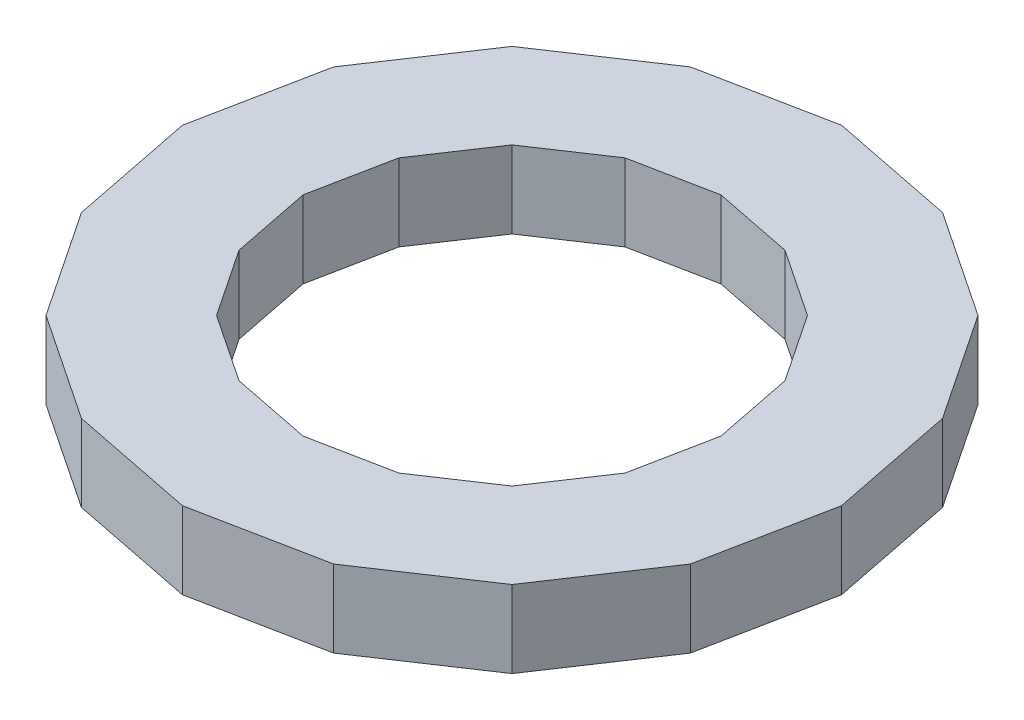
ISO-10303-21;
HEADER;
FILE_DESCRIPTION(('STEP AP214'),'2;1');
FILE_NAME('part.step','',(''),(''),'','','');
FILE_SCHEMA(('AUTOMOTIVE_DESIGN { 1 0 10303 214 1 1 1 1 }'));
ENDSEC;
DATA;
#1=APPLICATION_CONTEXT('core data for automotive mechanical design processes');
#2=APPLICATION_PROTOCOL_DEFINITION('international standard','automotive_design',2000,#1);
#3=PRODUCT_CONTEXT('',#1,'mechanical');
#4=PRODUCT('Part','Part','',(#3));
#5=PRODUCT_RELATED_PRODUCT_CATEGORY('part','',(#4));
#6=PRODUCT_DEFINITION_FORMATION('','',#4);
#7=PRODUCT_DEFINITION_CONTEXT('part definition',#1,'design');
#8=PRODUCT_DEFINITION('design','',#6,#7);
#9=PRODUCT_DEFINITION_SHAPE('','',#8);
#10=(LENGTH_UNIT() NAMED_UNIT(*) SI_UNIT(.MILLI.,.METRE.));
#11=(NAMED_UNIT(*) PLANE_ANGLE_UNIT() SI_UNIT($,.RADIAN.));
#12=(NAMED_UNIT(*) SI_UNIT($,.STERADIAN.) SOLID_ANGLE_UNIT());
#13=UNCERTAINTY_MEASURE_WITH_UNIT(LENGTH_MEASURE(1.E-05),#10,'distance_accuracy_value','');
#14=(GEOMETRIC_REPRESENTATION_CONTEXT(3) GLOBAL_UNCERTAINTY_ASSIGNED_CONTEXT((#13)) GLOBAL_UNIT_ASSIGNED_CONTEXT((#10,
#11,#12)) REPRESENTATION_CONTEXT('',''));
#15=CARTESIAN_POINT('',(0.,0.,0.));
#16=DIRECTION('',(0.,0.,1.));
#17=DIRECTION('',(1.,0.,0.));
#18=AXIS2_PLACEMENT_3D('',#15,#16,#17);
#19=CARTESIAN_POINT('',(0.,19.05,0.));
#20=DIRECTION('',(0.,1.,0.));
#21=DIRECTION('',(0.,0.,1.));
#22=AXIS2_PLACEMENT_3D('',#19,#20,#21);
#23=PLANE('',#22);
#24=DIRECTION('',(-0.195090322016129,0.,0.98078528040323));
#25=VECTOR('',#24,1.);
#26=CARTESIAN_POINT('',(-75.1784477417807,19.05,-31.1399326528025));
#27=LINE('',#26,#25);
#28=CARTESIAN_POINT('',(-75.1784477417807,19.05,-31.1399326528025));
#29=VERTEX_POINT('',#28);
#30=CARTESIAN_POINT('',(-81.3725654657927,19.05,0.));
#31=VERTEX_POINT('',#30);
#32=EDGE_CURVE('E363',#29,#31,#27,.T.);
#33=ORIENTED_EDGE('',*,*,#32,.T.);
#34=DIRECTION('',(0.195090322016128,0.,0.98078528040323));
#35=VECTOR('',#34,1.);
#36=CARTESIAN_POINT('',(-81.3725654657927,19.05,0.));
#37=LINE('',#36,#35);
#38=CARTESIAN_POINT('',(-75.1784477417807,19.05,31.1399326528025));
#39=VERTEX_POINT('',#38);
#40=EDGE_CURVE('E366',#31,#39,#37,.T.);
#41=ORIENTED_EDGE('',*,*,#40,.T.);
#42=DIRECTION('',(0.555570233019602,0.,0.831469612302546));
#43=VECTOR('',#42,1.);
#44=CARTESIAN_POINT('',(-75.1784477417807,19.05,31.1399326528025));
#45=LINE('',#44,#43);
#46=CARTESIAN_POINT('',(-57.5390928434084,19.05,57.5390928434083));
#47=VERTEX_POINT('',#46);
#48=EDGE_CURVE('E369',#39,#47,#45,.T.);
#49=ORIENTED_EDGE('',*,*,#48,.T.);
#50=DIRECTION('',(0.831469612302545,0.,0.555570233019603));
#51=VECTOR('',#50,1.);
#52=CARTESIAN_POINT('',(-57.5390928434084,19.05,57.5390928434083));
#53=LINE('',#52,#51);
#54=CARTESIAN_POINT('',(-31.1399326528025,19.05,75.1784477417807));
#55=VERTEX_POINT('',#54);
#56=EDGE_CURVE('E371',#47,#55,#53,.T.);
#57=ORIENTED_EDGE('',*,*,#56,.T.);
#58=DIRECTION('',(0.98078528040323,0.,0.195090322016128));
#59=VECTOR('',#58,1.);
#60=CARTESIAN_POINT('',(-31.1399326528025,19.05,75.1784477417807));
#61=LINE('',#60,#59);
#62=CARTESIAN_POINT('',(0.,19.05,81.3725654657928));
#63=VERTEX_POINT('',#62);
#64=EDGE_CURVE('E373',#55,#63,#61,.T.);
#65=ORIENTED_EDGE('',*,*,#64,.T.);
#66=DIRECTION('',(0.980785280403231,0.,-0.195090322016128));
#67=VECTOR('',#66,1.);
#68=CARTESIAN_POINT('',(0.,19.05,81.3725654657928));
#69=LINE('',#68,#67);
#70=CARTESIAN_POINT('',(31.1399326528025,19.05,75.1784477417808));
#71=VERTEX_POINT('',#70);
#72=EDGE_CURVE('E375',#63,#71,#69,.T.);
#73=ORIENTED_EDGE('',*,*,#72,.T.);
#74=DIRECTION('',(0.831469612302546,0.,-0.555570233019601));
#75=VECTOR('',#74,1.);
#76=CARTESIAN_POINT('',(31.1399326528025,19.05,75.1784477417808));
#77=LINE('',#76,#75);
#78=CARTESIAN_POINT('',(57.5390928434082,19.05,57.5390928434084));
#79=VERTEX_POINT('',#78);
#80=EDGE_CURVE('E377',#71,#79,#77,.T.);
#81=ORIENTED_EDGE('',*,*,#80,.T.);
#82=DIRECTION('',(0.555570233019603,0.,-0.831469612302545));
#83=VECTOR('',#82,1.);
#84=CARTESIAN_POINT('',(57.5390928434082,19.05,57.5390928434084));
#85=LINE('',#84,#83);
#86=CARTESIAN_POINT('',(75.1784477417806,19.05,31.1399326528027));
#87=VERTEX_POINT('',#86);
#88=EDGE_CURVE('E379',#79,#87,#85,.T.);
#89=ORIENTED_EDGE('',*,*,#88,.T.);
#90=DIRECTION('',(0.195090322016128,0.,-0.980785280403231));
#91=VECTOR('',#90,1.);
#92=CARTESIAN_POINT('',(75.1784477417806,19.05,31.1399326528027));
#93=LINE('',#92,#91);
#94=CARTESIAN_POINT('',(81.3725654657927,19.05,0.));
#95=VERTEX_POINT('',#94);
#96=EDGE_CURVE('E381',#87,#95,#93,.T.);
#97=ORIENTED_EDGE('',*,*,#96,.T.);
#98=DIRECTION('',(-0.195090322016127,0.,-0.980785280403231));
#99=VECTOR('',#98,1.);
#100=CARTESIAN_POINT('',(81.3725654657927,19.05,0.));
#101=LINE('',#100,#99);
#102=CARTESIAN_POINT('',(75.1784477417807,19.05,-31.1399326528024));
#103=VERTEX_POINT('',#102);
#104=EDGE_CURVE('E383',#95,#103,#101,.T.);
#105=ORIENTED_EDGE('',*,*,#104,.T.);
#106=DIRECTION('',(-0.555570233019601,0.,-0.831469612302546));
#107=VECTOR('',#106,1.);
#108=CARTESIAN_POINT('',(75.1784477417807,19.05,-31.1399326528024));
#109=LINE('',#108,#107);
#110=CARTESIAN_POINT('',(57.5390928434083,19.05,-57.5390928434082));
#111=VERTEX_POINT('',#110);
#112=EDGE_CURVE('E385',#103,#111,#109,.T.);
#113=ORIENTED_EDGE('',*,*,#112,.T.);
#114=DIRECTION('',(-0.831469612302545,0.,-0.555570233019603));
#115=VECTOR('',#114,1.);
#116=CARTESIAN_POINT('',(57.5390928434083,19.05,-57.5390928434082));
#117=LINE('',#116,#115);
#118=CARTESIAN_POINT('',(31.1399326528026,19.05,-75.1784477417806));
#119=VERTEX_POINT('',#118);
#120=EDGE_CURVE('E387',#111,#119,#117,.T.);
#121=ORIENTED_EDGE('',*,*,#120,.T.);
#122=DIRECTION('',(-0.98078528040323,0.,-0.195090322016128));
#123=VECTOR('',#122,1.);
#124=CARTESIAN_POINT('',(31.1399326528026,19.05,-75.1784477417806));
#125=LINE('',#124,#123);
#126=CARTESIAN_POINT('',(0.,19.05,-81.3725654657926));
#127=VERTEX_POINT('',#126);
#128=EDGE_CURVE('E389',#119,#127,#125,.T.);
#129=ORIENTED_EDGE('',*,*,#128,.T.);
#130=DIRECTION('',(-0.980785280403231,0.,0.195090322016127));
#131=VECTOR('',#130,1.);
#132=CARTESIAN_POINT('',(0.,19.05,-81.3725654657926));
#133=LINE('',#132,#131);
#134=CARTESIAN_POINT('',(-31.1399326528025,19.05,-75.1784477417806));
#135=VERTEX_POINT('',#134);
#136=EDGE_CURVE('E391',#127,#135,#133,.T.);
#137=ORIENTED_EDGE('',*,*,#136,.T.);
#138=DIRECTION('',(-0.831469612302546,0.,0.555570233019601));
#139=VECTOR('',#138,1.);
#140=CARTESIAN_POINT('',(-31.1399326528025,19.05,-75.1784477417806));
#141=LINE('',#140,#139);
#142=CARTESIAN_POINT('',(-57.5390928434083,19.05,-57.5390928434083));
#143=VERTEX_POINT('',#142);
#144=EDGE_CURVE('E393',#135,#143,#141,.T.);
#145=ORIENTED_EDGE('',*,*,#144,.T.);
#146=DIRECTION('',(-0.555570233019603,0.,0.831469612302545));
#147=VECTOR('',#146,1.);
#148=CARTESIAN_POINT('',(-57.5390928434083,19.05,-57.5390928434083));
#149=LINE('',#148,#147);
#150=EDGE_CURVE('E395',#143,#29,#149,.T.);
#151=ORIENTED_EDGE('',*,*,#150,.T.);
#152=EDGE_LOOP('',(#33,#41,#49,#57,#65,#73,#81,#89,#97,#105,#113,#121,#129,#137,#145,#151));
#153=FACE_BOUND('',#152,.T.);
#154=DIRECTION('',(0.195090322016128,0.,0.98078528040323));
#155=VECTOR('',#154,1.);
#156=CARTESIAN_POINT('',(-51.590307734528,19.05,0.));
#157=LINE('',#156,#155);
#158=CARTESIAN_POINT('',(-51.590307734528,19.05,0.));
#159=VERTEX_POINT('',#158);
#160=CARTESIAN_POINT('',(-47.6632293918892,19.05,19.7427560406204));
#161=VERTEX_POINT('',#160);
#162=EDGE_CURVE('E250',#159,#161,#157,.T.);
#163=ORIENTED_EDGE('',*,*,#162,.F.);
#164=DIRECTION('',(-0.195090322016128,0.,0.98078528040323));
#165=VECTOR('',#164,1.);
#166=CARTESIAN_POINT('',(-47.6632293918892,19.05,-19.7427560406204));
#167=LINE('',#166,#165);
#168=CARTESIAN_POINT('',(-47.6632293918892,19.05,-19.7427560406204));
#169=VERTEX_POINT('',#168);
#170=EDGE_CURVE('E242',#169,#159,#167,.T.);
#171=ORIENTED_EDGE('',*,*,#170,.F.);
#172=DIRECTION('',(-0.555570233019602,0.,0.831469612302546));
#173=VECTOR('',#172,1.);
#174=CARTESIAN_POINT('',(-36.4798564425856,19.05,-36.4798564425855));
#175=LINE('',#174,#173);
#176=CARTESIAN_POINT('',(-36.4798564425856,19.05,-36.4798564425855));
#177=VERTEX_POINT('',#176);
#178=EDGE_CURVE('E291',#177,#169,#175,.T.);
#179=ORIENTED_EDGE('',*,*,#178,.F.);
#180=DIRECTION('',(-0.831469612302545,0.,0.555570233019603));
#181=VECTOR('',#180,1.);
#182=CARTESIAN_POINT('',(-19.7427560406204,19.05,-47.6632293918892));
#183=LINE('',#182,#181);
#184=CARTESIAN_POINT('',(-19.7427560406204,19.05,-47.6632293918892));
#185=VERTEX_POINT('',#184);
#186=EDGE_CURVE('E289',#185,#177,#183,.T.);
#187=ORIENTED_EDGE('',*,*,#186,.F.);
#188=DIRECTION('',(-0.980785280403231,0.,0.195090322016129));
#189=VECTOR('',#188,1.);
#190=CARTESIAN_POINT('',(0.,19.05,-51.590307734528));
#191=LINE('',#190,#189);
#192=CARTESIAN_POINT('',(0.,19.05,-51.590307734528));
#193=VERTEX_POINT('',#192);
#194=EDGE_CURVE('E287',#193,#185,#191,.T.);
#195=ORIENTED_EDGE('',*,*,#194,.F.);
#196=DIRECTION('',(-0.980785280403231,0.,-0.195090322016128));
#197=VECTOR('',#196,1.);
#198=CARTESIAN_POINT('',(19.7427560406203,19.05,-47.6632293918892));
#199=LINE('',#198,#197);
#200=CARTESIAN_POINT('',(19.7427560406203,19.05,-47.6632293918892));
#201=VERTEX_POINT('',#200);
#202=EDGE_CURVE('E285',#201,#193,#199,.T.);
#203=ORIENTED_EDGE('',*,*,#202,.F.);
#204=DIRECTION('',(-0.831469612302546,0.,-0.555570233019602));
#205=VECTOR('',#204,1.);
#206=CARTESIAN_POINT('',(36.4798564425856,19.05,-36.4798564425856));
#207=LINE('',#206,#205);
#208=CARTESIAN_POINT('',(36.4798564425856,19.05,-36.4798564425856));
#209=VERTEX_POINT('',#208);
#210=EDGE_CURVE('E283',#209,#201,#207,.T.);
#211=ORIENTED_EDGE('',*,*,#210,.F.);
#212=DIRECTION('',(-0.555570233019603,0.,-0.831469612302545));
#213=VECTOR('',#212,1.);
#214=CARTESIAN_POINT('',(47.6632293918892,19.05,-19.7427560406204));
#215=LINE('',#214,#213);
#216=CARTESIAN_POINT('',(47.6632293918892,19.05,-19.7427560406204));
#217=VERTEX_POINT('',#216);
#218=EDGE_CURVE('E281',#217,#209,#215,.T.);
#219=ORIENTED_EDGE('',*,*,#218,.F.);
#220=DIRECTION('',(-0.195090322016129,0.,-0.98078528040323));
#221=VECTOR('',#220,1.);
#222=CARTESIAN_POINT('',(51.590307734528,19.05,0.));
#223=LINE('',#222,#221);
#224=CARTESIAN_POINT('',(51.590307734528,19.05,0.));
#225=VERTEX_POINT('',#224);
#226=EDGE_CURVE('E279',#225,#217,#223,.T.);
#227=ORIENTED_EDGE('',*,*,#226,.F.);
#228=DIRECTION('',(0.195090322016128,0.,-0.980785280403231));
#229=VECTOR('',#228,1.);
#230=CARTESIAN_POINT('',(47.6632293918892,19.05,19.7427560406204));
#231=LINE('',#230,#229);
#232=CARTESIAN_POINT('',(47.6632293918892,19.05,19.7427560406204));
#233=VERTEX_POINT('',#232);
#234=EDGE_CURVE('E277',#233,#225,#231,.T.);
#235=ORIENTED_EDGE('',*,*,#234,.F.);
#236=DIRECTION('',(0.555570233019602,0.,-0.831469612302546));
#237=VECTOR('',#236,1.);
#238=CARTESIAN_POINT('',(36.4798564425856,19.05,36.4798564425855));
#239=LINE('',#238,#237);
#240=CARTESIAN_POINT('',(36.4798564425856,19.05,36.4798564425855));
#241=VERTEX_POINT('',#240);
#242=EDGE_CURVE('E275',#241,#233,#239,.T.);
#243=ORIENTED_EDGE('',*,*,#242,.F.);
#244=DIRECTION('',(0.831469612302545,0.,-0.555570233019603));
#245=VECTOR('',#244,1.);
#246=CARTESIAN_POINT('',(19.7427560406204,19.05,47.6632293918892));
#247=LINE('',#246,#245);
#248=CARTESIAN_POINT('',(19.7427560406204,19.05,47.6632293918892));
#249=VERTEX_POINT('',#248);
#250=EDGE_CURVE('E273',#249,#241,#247,.T.);
#251=ORIENTED_EDGE('',*,*,#250,.F.);
#252=DIRECTION('',(0.98078528040323,0.,-0.195090322016129));
#253=VECTOR('',#252,1.);
#254=CARTESIAN_POINT('',(0.,19.05,51.590307734528));
#255=LINE('',#254,#253);
#256=CARTESIAN_POINT('',(0.,19.05,51.590307734528));
#257=VERTEX_POINT('',#256);
#258=EDGE_CURVE('E271',#257,#249,#255,.T.);
#259=ORIENTED_EDGE('',*,*,#258,.F.);
#260=DIRECTION('',(0.980785280403231,0.,0.195090322016128));
#261=VECTOR('',#260,1.);
#262=CARTESIAN_POINT('',(-19.7427560406204,19.05,47.6632293918892));
#263=LINE('',#262,#261);
#264=CARTESIAN_POINT('',(-19.7427560406204,19.05,47.6632293918892));
#265=VERTEX_POINT('',#264);
#266=EDGE_CURVE('E269',#265,#257,#263,.T.);
#267=ORIENTED_EDGE('',*,*,#266,.F.);
#268=DIRECTION('',(0.831469612302546,0.,0.555570233019601));
#269=VECTOR('',#268,1.);
#270=CARTESIAN_POINT('',(-36.4798564425855,19.05,36.4798564425856));
#271=LINE('',#270,#269);
#272=CARTESIAN_POINT('',(-36.4798564425855,19.05,36.4798564425856));
#273=VERTEX_POINT('',#272);
#274=EDGE_CURVE('E265',#273,#265,#271,.T.);
#275=ORIENTED_EDGE('',*,*,#274,.F.);
#276=DIRECTION('',(0.555570233019603,0.,0.831469612302545));
#277=VECTOR('',#276,1.);
#278=CARTESIAN_POINT('',(-47.6632293918892,19.05,19.7427560406204));
#279=LINE('',#278,#277);
#280=EDGE_CURVE('E263',#161,#273,#279,.T.);
#281=ORIENTED_EDGE('',*,*,#280,.F.);
#282=EDGE_LOOP('',(#163,#171,#179,#187,#195,#203,#211,#219,#227,#235,#243,#251,#259,#267,#275,#281));
#283=FACE_BOUND('',#282,.T.);
#284=ADVANCED_FACE('F33',(#153,#283),#23,.T.);
#285=CARTESIAN_POINT('',(0.,0.,0.));
#286=DIRECTION('',(0.,1.,0.));
#287=DIRECTION('',(0.,0.,1.));
#288=AXIS2_PLACEMENT_3D('',#285,#286,#287);
#289=PLANE('',#288);
#290=DIRECTION('',(-0.195090322016129,0.,0.98078528040323));
#291=VECTOR('',#290,1.);
#292=CARTESIAN_POINT('',(-75.1784477417807,0.,-31.1399326528025));
#293=LINE('',#292,#291);
#294=CARTESIAN_POINT('',(-75.1784477417807,0.,-31.1399326528025));
#295=VERTEX_POINT('',#294);
#296=CARTESIAN_POINT('',(-81.3725654657927,0.,0.));
#297=VERTEX_POINT('',#296);
#298=EDGE_CURVE('E258',#295,#297,#293,.T.);
#299=ORIENTED_EDGE('',*,*,#298,.F.);
#300=DIRECTION('',(-0.555570233019603,0.,0.831469612302545));
#301=VECTOR('',#300,1.);
#302=CARTESIAN_POINT('',(-57.5390928434083,0.,-57.5390928434083));
#303=LINE('',#302,#301);
#304=CARTESIAN_POINT('',(-57.5390928434083,0.,-57.5390928434083));
#305=VERTEX_POINT('',#304);
#306=EDGE_CURVE('E367',#305,#295,#303,.T.);
#307=ORIENTED_EDGE('',*,*,#306,.F.);
#308=DIRECTION('',(-0.831469612302546,0.,0.555570233019601));
#309=VECTOR('',#308,1.);
#310=CARTESIAN_POINT('',(-31.1399326528025,0.,-75.1784477417806));
#311=LINE('',#310,#309);
#312=CARTESIAN_POINT('',(-31.1399326528025,0.,-75.1784477417806));
#313=VERTEX_POINT('',#312);
#314=EDGE_CURVE('E426',#313,#305,#311,.T.);
#315=ORIENTED_EDGE('',*,*,#314,.F.);
#316=DIRECTION('',(-0.980785280403231,0.,0.195090322016127));
#317=VECTOR('',#316,1.);
#318=CARTESIAN_POINT('',(0.,0.,-81.3725654657926));
#319=LINE('',#318,#317);
#320=CARTESIAN_POINT('',(0.,0.,-81.3725654657926));
#321=VERTEX_POINT('',#320);
#322=EDGE_CURVE('E424',#321,#313,#319,.T.);
#323=ORIENTED_EDGE('',*,*,#322,.F.);
#324=DIRECTION('',(-0.98078528040323,0.,-0.195090322016128));
#325=VECTOR('',#324,1.);
#326=CARTESIAN_POINT('',(31.1399326528026,0.,-75.1784477417806));
#327=LINE('',#326,#325);
#328=CARTESIAN_POINT('',(31.1399326528026,0.,-75.1784477417806));
#329=VERTEX_POINT('',#328);
#330=EDGE_CURVE('E422',#329,#321,#327,.T.);
#331=ORIENTED_EDGE('',*,*,#330,.F.);
#332=DIRECTION('',(-0.831469612302545,0.,-0.555570233019603));
#333=VECTOR('',#332,1.);
#334=CARTESIAN_POINT('',(57.5390928434083,0.,-57.5390928434082));
#335=LINE('',#334,#333);
#336=CARTESIAN_POINT('',(57.5390928434083,0.,-57.5390928434082));
#337=VERTEX_POINT('',#336);
#338=EDGE_CURVE('E420',#337,#329,#335,.T.);
#339=ORIENTED_EDGE('',*,*,#338,.F.);
#340=DIRECTION('',(-0.555570233019601,0.,-0.831469612302546));
#341=VECTOR('',#340,1.);
#342=CARTESIAN_POINT('',(75.1784477417807,0.,-31.1399326528024));
#343=LINE('',#342,#341);
#344=CARTESIAN_POINT('',(75.1784477417807,0.,-31.1399326528024));
#345=VERTEX_POINT('',#344);
#346=EDGE_CURVE('E418',#345,#337,#343,.T.);
#347=ORIENTED_EDGE('',*,*,#346,.F.);
#348=DIRECTION('',(-0.195090322016127,0.,-0.980785280403231));
#349=VECTOR('',#348,1.);
#350=CARTESIAN_POINT('',(81.3725654657927,0.,0.));
#351=LINE('',#350,#349);
#352=CARTESIAN_POINT('',(81.3725654657927,0.,0.));
#353=VERTEX_POINT('',#352);
#354=EDGE_CURVE('E416',#353,#345,#351,.T.);
#355=ORIENTED_EDGE('',*,*,#354,.F.);
#356=DIRECTION('',(0.195090322016128,0.,-0.980785280403231));
#357=VECTOR('',#356,1.);
#358=CARTESIAN_POINT('',(75.1784477417806,0.,31.1399326528027));
#359=LINE('',#358,#357);
#360=CARTESIAN_POINT('',(75.1784477417806,0.,31.1399326528027));
#361=VERTEX_POINT('',#360);
#362=EDGE_CURVE('E414',#361,#353,#359,.T.);
#363=ORIENTED_EDGE('',*,*,#362,.F.);
#364=DIRECTION('',(0.555570233019603,0.,-0.831469612302545));
#365=VECTOR('',#364,1.);
#366=CARTESIAN_POINT('',(57.5390928434082,0.,57.5390928434084));
#367=LINE('',#366,#365);
#368=CARTESIAN_POINT('',(57.5390928434082,0.,57.5390928434084));
#369=VERTEX_POINT('',#368);
#370=EDGE_CURVE('E412',#369,#361,#367,.T.);
#371=ORIENTED_EDGE('',*,*,#370,.F.);
#372=DIRECTION('',(0.831469612302546,0.,-0.555570233019601));
#373=VECTOR('',#372,1.);
#374=CARTESIAN_POINT('',(31.1399326528025,0.,75.1784477417808));
#375=LINE('',#374,#373);
#376=CARTESIAN_POINT('',(31.1399326528025,0.,75.1784477417808));
#377=VERTEX_POINT('',#376);
#378=EDGE_CURVE('E410',#377,#369,#375,.T.);
#379=ORIENTED_EDGE('',*,*,#378,.F.);
#380=DIRECTION('',(0.980785280403231,0.,-0.195090322016128));
#381=VECTOR('',#380,1.);
#382=CARTESIAN_POINT('',(0.,0.,81.3725654657928));
#383=LINE('',#382,#381);
#384=CARTESIAN_POINT('',(0.,0.,81.3725654657928));
#385=VERTEX_POINT('',#384);
#386=EDGE_CURVE('E408',#385,#377,#383,.T.);
#387=ORIENTED_EDGE('',*,*,#386,.F.);
#388=DIRECTION('',(0.98078528040323,0.,0.195090322016128));
#389=VECTOR('',#388,1.);
#390=CARTESIAN_POINT('',(-31.1399326528025,0.,75.1784477417807));
#391=LINE('',#390,#389);
#392=CARTESIAN_POINT('',(-31.1399326528025,0.,75.1784477417807));
#393=VERTEX_POINT('',#392);
#394=EDGE_CURVE('E406',#393,#385,#391,.T.);
#395=ORIENTED_EDGE('',*,*,#394,.F.);
#396=DIRECTION('',(0.831469612302545,0.,0.555570233019603));
#397=VECTOR('',#396,1.);
#398=CARTESIAN_POINT('',(-57.5390928434084,0.,57.5390928434083));
#399=LINE('',#398,#397);
#400=CARTESIAN_POINT('',(-57.5390928434084,0.,57.5390928434083));
#401=VERTEX_POINT('',#400);
#402=EDGE_CURVE('E404',#401,#393,#399,.T.);
#403=ORIENTED_EDGE('',*,*,#402,.F.);
#404=DIRECTION('',(0.555570233019602,0.,0.831469612302546));
#405=VECTOR('',#404,1.);
#406=CARTESIAN_POINT('',(-75.1784477417807,0.,31.1399326528025));
#407=LINE('',#406,#405);
#408=CARTESIAN_POINT('',(-75.1784477417807,0.,31.1399326528025));
#409=VERTEX_POINT('',#408);
#410=EDGE_CURVE('E402',#409,#401,#407,.T.);
#411=ORIENTED_EDGE('',*,*,#410,.F.);
#412=DIRECTION('',(0.195090322016128,0.,0.98078528040323));
#413=VECTOR('',#412,1.);
#414=CARTESIAN_POINT('',(-81.3725654657927,0.,0.));
#415=LINE('',#414,#413);
#416=EDGE_CURVE('E400',#297,#409,#415,.T.);
#417=ORIENTED_EDGE('',*,*,#416,.F.);
#418=EDGE_LOOP('',(#299,#307,#315,#323,#331,#339,#347,#355,#363,#371,#379,#387,#395,#403,#411,#417));
#419=FACE_BOUND('',#418,.T.);
#420=DIRECTION('',(-0.195090322016128,0.,0.98078528040323));
#421=VECTOR('',#420,1.);
#422=CARTESIAN_POINT('',(-47.6632293918892,0.,-19.7427560406204));
#423=LINE('',#422,#421);
#424=CARTESIAN_POINT('',(-47.6632293918892,0.,-19.7427560406204));
#425=VERTEX_POINT('',#424);
#426=CARTESIAN_POINT('',(-51.590307734528,0.,0.));
#427=VERTEX_POINT('',#426);
#428=EDGE_CURVE('E56',#425,#427,#423,.T.);
#429=ORIENTED_EDGE('',*,*,#428,.T.);
#430=DIRECTION('',(0.195090322016128,0.,0.98078528040323));
#431=VECTOR('',#430,1.);
#432=CARTESIAN_POINT('',(-51.590307734528,0.,0.));
#433=LINE('',#432,#431);
#434=CARTESIAN_POINT('',(-47.6632293918892,0.,19.7427560406204));
#435=VERTEX_POINT('',#434);
#436=EDGE_CURVE('E257',#427,#435,#433,.T.);
#437=ORIENTED_EDGE('',*,*,#436,.T.);
#438=DIRECTION('',(0.555570233019603,0.,0.831469612302545));
#439=VECTOR('',#438,1.);
#440=CARTESIAN_POINT('',(-47.6632293918892,0.,19.7427560406204));
#441=LINE('',#440,#439);
#442=CARTESIAN_POINT('',(-36.4798564425855,0.,36.4798564425856));
#443=VERTEX_POINT('',#442);
#444=EDGE_CURVE('E295',#435,#443,#441,.T.);
#445=ORIENTED_EDGE('',*,*,#444,.T.);
#446=DIRECTION('',(0.831469612302546,0.,0.555570233019601));
#447=VECTOR('',#446,1.);
#448=CARTESIAN_POINT('',(-36.4798564425855,0.,36.4798564425856));
#449=LINE('',#448,#447);
#450=CARTESIAN_POINT('',(-19.7427560406204,0.,47.6632293918892));
#451=VERTEX_POINT('',#450);
#452=EDGE_CURVE('E298',#443,#451,#449,.T.);
#453=ORIENTED_EDGE('',*,*,#452,.T.);
#454=DIRECTION('',(0.980785280403231,0.,0.195090322016128));
#455=VECTOR('',#454,1.);
#456=CARTESIAN_POINT('',(-19.7427560406204,0.,47.6632293918892));
#457=LINE('',#456,#455);
#458=CARTESIAN_POINT('',(0.,0.,51.590307734528));
#459=VERTEX_POINT('',#458);
#460=EDGE_CURVE('E301',#451,#459,#457,.T.);
#461=ORIENTED_EDGE('',*,*,#460,.T.);
#462=DIRECTION('',(0.98078528040323,0.,-0.195090322016129));
#463=VECTOR('',#462,1.);
#464=CARTESIAN_POINT('',(0.,0.,51.590307734528));
#465=LINE('',#464,#463);
#466=CARTESIAN_POINT('',(19.7427560406204,0.,47.6632293918892));
#467=VERTEX_POINT('',#466);
#468=EDGE_CURVE('E304',#459,#467,#465,.T.);
#469=ORIENTED_EDGE('',*,*,#468,.T.);
#470=DIRECTION('',(0.831469612302545,0.,-0.555570233019603));
#471=VECTOR('',#470,1.);
#472=CARTESIAN_POINT('',(19.7427560406204,0.,47.6632293918892));
#473=LINE('',#472,#471);
#474=CARTESIAN_POINT('',(36.4798564425856,0.,36.4798564425855));
#475=VERTEX_POINT('',#474);
#476=EDGE_CURVE('E307',#467,#475,#473,.T.);
#477=ORIENTED_EDGE('',*,*,#476,.T.);
#478=DIRECTION('',(0.555570233019602,0.,-0.831469612302546));
#479=VECTOR('',#478,1.);
#480=CARTESIAN_POINT('',(36.4798564425856,0.,36.4798564425855));
#481=LINE('',#480,#479);
#482=CARTESIAN_POINT('',(47.6632293918892,0.,19.7427560406204));
#483=VERTEX_POINT('',#482);
#484=EDGE_CURVE('E310',#475,#483,#481,.T.);
#485=ORIENTED_EDGE('',*,*,#484,.T.);
#486=DIRECTION('',(0.195090322016128,0.,-0.980785280403231));
#487=VECTOR('',#486,1.);
#488=CARTESIAN_POINT('',(47.6632293918892,0.,19.7427560406204));
#489=LINE('',#488,#487);
#490=CARTESIAN_POINT('',(51.590307734528,0.,0.));
#491=VERTEX_POINT('',#490);
#492=EDGE_CURVE('E313',#483,#491,#489,.T.);
#493=ORIENTED_EDGE('',*,*,#492,.T.);
#494=DIRECTION('',(-0.195090322016129,0.,-0.98078528040323));
#495=VECTOR('',#494,1.);
#496=CARTESIAN_POINT('',(51.590307734528,0.,0.));
#497=LINE('',#496,#495);
#498=CARTESIAN_POINT('',(47.6632293918892,0.,-19.7427560406204));
#499=VERTEX_POINT('',#498);
#500=EDGE_CURVE('E316',#491,#499,#497,.T.);
#501=ORIENTED_EDGE('',*,*,#500,.T.);
#502=DIRECTION('',(-0.555570233019603,0.,-0.831469612302545));
#503=VECTOR('',#502,1.);
#504=CARTESIAN_POINT('',(47.6632293918892,0.,-19.7427560406204));
#505=LINE('',#504,#503);
#506=CARTESIAN_POINT('',(36.4798564425856,0.,-36.4798564425856));
#507=VERTEX_POINT('',#506);
#508=EDGE_CURVE('E319',#499,#507,#505,.T.);
#509=ORIENTED_EDGE('',*,*,#508,.T.);
#510=DIRECTION('',(-0.831469612302546,0.,-0.555570233019602));
#511=VECTOR('',#510,1.);
#512=CARTESIAN_POINT('',(36.4798564425856,0.,-36.4798564425856));
#513=LINE('',#512,#511);
#514=CARTESIAN_POINT('',(19.7427560406203,0.,-47.6632293918892));
#515=VERTEX_POINT('',#514);
#516=EDGE_CURVE('E322',#507,#515,#513,.T.);
#517=ORIENTED_EDGE('',*,*,#516,.T.);
#518=DIRECTION('',(-0.980785280403231,0.,-0.195090322016128));
#519=VECTOR('',#518,1.);
#520=CARTESIAN_POINT('',(19.7427560406203,0.,-47.6632293918892));
#521=LINE('',#520,#519);
#522=CARTESIAN_POINT('',(0.,0.,-51.590307734528));
#523=VERTEX_POINT('',#522);
#524=EDGE_CURVE('E325',#515,#523,#521,.T.);
#525=ORIENTED_EDGE('',*,*,#524,.T.);
#526=DIRECTION('',(-0.980785280403231,0.,0.195090322016129));
#527=VECTOR('',#526,1.);
#528=CARTESIAN_POINT('',(0.,0.,-51.590307734528));
#529=LINE('',#528,#527);
#530=CARTESIAN_POINT('',(-19.7427560406204,0.,-47.6632293918892));
#531=VERTEX_POINT('',#530);
#532=EDGE_CURVE('E328',#523,#531,#529,.T.);
#533=ORIENTED_EDGE('',*,*,#532,.T.);
#534=DIRECTION('',(-0.831469612302545,0.,0.555570233019603));
#535=VECTOR('',#534,1.);
#536=CARTESIAN_POINT('',(-19.7427560406204,0.,-47.6632293918892));
#537=LINE('',#536,#535);
#538=CARTESIAN_POINT('',(-36.4798564425856,0.,-36.4798564425855));
#539=VERTEX_POINT('',#538);
#540=EDGE_CURVE('E331',#531,#539,#537,.T.);
#541=ORIENTED_EDGE('',*,*,#540,.T.);
#542=DIRECTION('',(-0.555570233019602,0.,0.831469612302546));
#543=VECTOR('',#542,1.);
#544=CARTESIAN_POINT('',(-36.4798564425856,0.,-36.4798564425855));
#545=LINE('',#544,#543);
#546=EDGE_CURVE('E251',#539,#425,#545,.T.);
#547=ORIENTED_EDGE('',*,*,#546,.T.);
#548=EDGE_LOOP('',(#429,#437,#445,#453,#461,#469,#477,#485,#493,#501,#509,#517,#525,#533,#541,#547));
#549=FACE_BOUND('',#548,.T.);
#550=ADVANCED_FACE('F480',(#419,#549),#289,.F.);
#551=CARTESIAN_POINT('',(-75.1784477417807,19.05,-31.1399326528025));
#552=DIRECTION('',(0.98078528040323,0.,0.195090322016129));
#553=DIRECTION('',(0.195090322016129,0.,-0.98078528040323));
#554=AXIS2_PLACEMENT_3D('',#551,#552,#553);
#555=PLANE('',#554);
#556=ORIENTED_EDGE('',*,*,#298,.T.);
#557=DIRECTION('',(0.,-1.,0.));
#558=VECTOR('',#557,1.);
#559=CARTESIAN_POINT('',(-81.3725654657927,19.05,0.));
#560=LINE('',#559,#558);
#561=EDGE_CURVE('E11',#31,#297,#560,.T.);
#562=ORIENTED_EDGE('',*,*,#561,.F.);
#563=ORIENTED_EDGE('',*,*,#32,.F.);
#564=DIRECTION('',(0.,-1.,0.));
#565=VECTOR('',#564,1.);
#566=CARTESIAN_POINT('',(-75.1784477417807,19.05,-31.1399326528025));
#567=LINE('',#566,#565);
#568=EDGE_CURVE('E397',#29,#295,#567,.T.);
#569=ORIENTED_EDGE('',*,*,#568,.T.);
#570=EDGE_LOOP('',(#556,#562,#563,#569));
#571=FACE_BOUND('',#570,.T.);
#572=ADVANCED_FACE('F35',(#571),#555,.F.);
#573=CARTESIAN_POINT('',(-81.3725654657927,19.05,0.));
#574=DIRECTION('',(0.980785280403231,0.,-0.195090322016128));
#575=DIRECTION('',(-0.195090322016128,0.,-0.980785280403231));
#576=AXIS2_PLACEMENT_3D('',#573,#574,#575);
#577=PLANE('',#576);
#578=ORIENTED_EDGE('',*,*,#416,.T.);
#579=DIRECTION('',(0.,-1.,0.));
#580=VECTOR('',#579,1.);
#581=CARTESIAN_POINT('',(-75.1784477417807,19.05,31.1399326528025));
#582=LINE('',#581,#580);
#583=EDGE_CURVE('E41',#39,#409,#582,.T.);
#584=ORIENTED_EDGE('',*,*,#583,.F.);
#585=ORIENTED_EDGE('',*,*,#40,.F.);
#586=ORIENTED_EDGE('',*,*,#561,.T.);
#587=EDGE_LOOP('',(#578,#584,#585,#586));
#588=FACE_BOUND('',#587,.T.);
#589=ADVANCED_FACE('F497',(#588),#577,.F.);
#590=CARTESIAN_POINT('',(-75.1784477417807,19.05,31.1399326528025));
#591=DIRECTION('',(0.831469612302546,0.,-0.555570233019602));
#592=DIRECTION('',(-0.555570233019602,0.,-0.831469612302546));
#593=AXIS2_PLACEMENT_3D('',#590,#591,#592);
#594=PLANE('',#593);
#595=ORIENTED_EDGE('',*,*,#410,.T.);
#596=DIRECTION('',(0.,-1.,0.));
#597=VECTOR('',#596,1.);
#598=CARTESIAN_POINT('',(-57.5390928434084,19.05,57.5390928434083));
#599=LINE('',#598,#597);
#600=EDGE_CURVE('E467',#47,#401,#599,.T.);
#601=ORIENTED_EDGE('',*,*,#600,.F.);
#602=ORIENTED_EDGE('',*,*,#48,.F.);
#603=ORIENTED_EDGE('',*,*,#583,.T.);
#604=EDGE_LOOP('',(#595,#601,#602,#603));
#605=FACE_BOUND('',#604,.T.);
#606=ADVANCED_FACE('F474',(#605),#594,.F.);
#607=CARTESIAN_POINT('',(-57.5390928434084,19.05,57.5390928434083));
#608=DIRECTION('',(0.555570233019603,0.,-0.831469612302545));
#609=DIRECTION('',(-0.831469612302545,0.,-0.555570233019603));
#610=AXIS2_PLACEMENT_3D('',#607,#608,#609);
#611=PLANE('',#610);
#612=ORIENTED_EDGE('',*,*,#402,.T.);
#613=DIRECTION('',(0.,-1.,0.));
#614=VECTOR('',#613,1.);
#615=CARTESIAN_POINT('',(-31.1399326528025,19.05,75.1784477417807));
#616=LINE('',#615,#614);
#617=EDGE_CURVE('E464',#55,#393,#616,.T.);
#618=ORIENTED_EDGE('',*,*,#617,.F.);
#619=ORIENTED_EDGE('',*,*,#56,.F.);
#620=ORIENTED_EDGE('',*,*,#600,.T.);
#621=EDGE_LOOP('',(#612,#618,#619,#620));
#622=FACE_BOUND('',#621,.T.);
#623=ADVANCED_FACE('F486',(#622),#611,.F.);
#624=CARTESIAN_POINT('',(-31.1399326528025,19.05,75.1784477417807));
#625=DIRECTION('',(0.195090322016128,0.,-0.98078528040323));
#626=DIRECTION('',(-0.980785280403231,0.,-0.195090322016128));
#627=AXIS2_PLACEMENT_3D('',#624,#625,#626);
#628=PLANE('',#627);
#629=ORIENTED_EDGE('',*,*,#394,.T.);
#630=DIRECTION('',(0.,-1.,0.));
#631=VECTOR('',#630,1.);
#632=CARTESIAN_POINT('',(0.,19.05,81.3725654657928));
#633=LINE('',#632,#631);
#634=EDGE_CURVE('E461',#63,#385,#633,.T.);
#635=ORIENTED_EDGE('',*,*,#634,.F.);
#636=ORIENTED_EDGE('',*,*,#64,.F.);
#637=ORIENTED_EDGE('',*,*,#617,.T.);
#638=EDGE_LOOP('',(#629,#635,#636,#637));
#639=FACE_BOUND('',#638,.T.);
#640=ADVANCED_FACE('F490',(#639),#628,.F.);
#641=CARTESIAN_POINT('',(0.,19.05,81.3725654657928));
#642=DIRECTION('',(-0.195090322016128,0.,-0.980785280403231));
#643=DIRECTION('',(-0.980785280403231,0.,0.195090322016128));
#644=AXIS2_PLACEMENT_3D('',#641,#642,#643);
#645=PLANE('',#644);
#646=ORIENTED_EDGE('',*,*,#386,.T.);
#647=DIRECTION('',(0.,-1.,0.));
#648=VECTOR('',#647,1.);
#649=CARTESIAN_POINT('',(31.1399326528025,19.05,75.1784477417808));
#650=LINE('',#649,#648);
#651=EDGE_CURVE('E458',#71,#377,#650,.T.);
#652=ORIENTED_EDGE('',*,*,#651,.F.);
#653=ORIENTED_EDGE('',*,*,#72,.F.);
#654=ORIENTED_EDGE('',*,*,#634,.T.);
#655=EDGE_LOOP('',(#646,#652,#653,#654));
#656=FACE_BOUND('',#655,.T.);
#657=ADVANCED_FACE('F550',(#656),#645,.F.);
#658=CARTESIAN_POINT('',(31.1399326528025,19.05,75.1784477417808));
#659=DIRECTION('',(-0.555570233019601,0.,-0.831469612302546));
#660=DIRECTION('',(-0.831469612302546,0.,0.555570233019601));
#661=AXIS2_PLACEMENT_3D('',#658,#659,#660);
#662=PLANE('',#661);
#663=ORIENTED_EDGE('',*,*,#378,.T.);
#664=DIRECTION('',(0.,-1.,0.));
#665=VECTOR('',#664,1.);
#666=CARTESIAN_POINT('',(57.5390928434082,19.05,57.5390928434084));
#667=LINE('',#666,#665);
#668=EDGE_CURVE('E455',#79,#369,#667,.T.);
#669=ORIENTED_EDGE('',*,*,#668,.F.);
#670=ORIENTED_EDGE('',*,*,#80,.F.);
#671=ORIENTED_EDGE('',*,*,#651,.T.);
#672=EDGE_LOOP('',(#663,#669,#670,#671));
#673=FACE_BOUND('',#672,.T.);
#674=ADVANCED_FACE('F547',(#673),#662,.F.);
#675=CARTESIAN_POINT('',(57.5390928434082,19.05,57.5390928434084));
#676=DIRECTION('',(-0.831469612302545,0.,-0.555570233019603));
#677=DIRECTION('',(-0.555570233019603,0.,0.831469612302545));
#678=AXIS2_PLACEMENT_3D('',#675,#676,#677);
#679=PLANE('',#678);
#680=ORIENTED_EDGE('',*,*,#370,.T.);
#681=DIRECTION('',(0.,-1.,0.));
#682=VECTOR('',#681,1.);
#683=CARTESIAN_POINT('',(75.1784477417806,19.05,31.1399326528027));
#684=LINE('',#683,#682);
#685=EDGE_CURVE('E452',#87,#361,#684,.T.);
#686=ORIENTED_EDGE('',*,*,#685,.F.);
#687=ORIENTED_EDGE('',*,*,#88,.F.);
#688=ORIENTED_EDGE('',*,*,#668,.T.);
#689=EDGE_LOOP('',(#680,#686,#687,#688));
#690=FACE_BOUND('',#689,.T.);
#691=ADVANCED_FACE('F543',(#690),#679,.F.);
#692=CARTESIAN_POINT('',(75.1784477417806,19.05,31.1399326528027));
#693=DIRECTION('',(-0.98078528040323,0.,-0.195090322016128));
#694=DIRECTION('',(-0.195090322016128,0.,0.98078528040323));
#695=AXIS2_PLACEMENT_3D('',#692,#693,#694);
#696=PLANE('',#695);
#697=ORIENTED_EDGE('',*,*,#362,.T.);
#698=DIRECTION('',(0.,-1.,0.));
#699=VECTOR('',#698,1.);
#700=CARTESIAN_POINT('',(81.3725654657927,19.05,0.));
#701=LINE('',#700,#699);
#702=EDGE_CURVE('E449',#95,#353,#701,.T.);
#703=ORIENTED_EDGE('',*,*,#702,.F.);
#704=ORIENTED_EDGE('',*,*,#96,.F.);
#705=ORIENTED_EDGE('',*,*,#685,.T.);
#706=EDGE_LOOP('',(#697,#703,#704,#705));
#707=FACE_BOUND('',#706,.T.);
#708=ADVANCED_FACE('F539',(#707),#696,.F.);
#709=CARTESIAN_POINT('',(81.3725654657927,19.05,0.));
#710=DIRECTION('',(-0.980785280403231,0.,0.195090322016127));
#711=DIRECTION('',(0.195090322016127,0.,0.980785280403231));
#712=AXIS2_PLACEMENT_3D('',#709,#710,#711);
#713=PLANE('',#712);
#714=ORIENTED_EDGE('',*,*,#354,.T.);
#715=DIRECTION('',(0.,-1.,0.));
#716=VECTOR('',#715,1.);
#717=CARTESIAN_POINT('',(75.1784477417807,19.05,-31.1399326528024));
#718=LINE('',#717,#716);
#719=EDGE_CURVE('E446',#103,#345,#718,.T.);
#720=ORIENTED_EDGE('',*,*,#719,.F.);
#721=ORIENTED_EDGE('',*,*,#104,.F.);
#722=ORIENTED_EDGE('',*,*,#702,.T.);
#723=EDGE_LOOP('',(#714,#720,#721,#722));
#724=FACE_BOUND('',#723,.T.);
#725=ADVANCED_FACE('F534',(#724),#713,.F.);
#726=CARTESIAN_POINT('',(75.1784477417807,19.05,-31.1399326528024));
#727=DIRECTION('',(-0.831469612302546,0.,0.555570233019601));
#728=DIRECTION('',(0.555570233019601,0.,0.831469612302546));
#729=AXIS2_PLACEMENT_3D('',#726,#727,#728);
#730=PLANE('',#729);
#731=ORIENTED_EDGE('',*,*,#346,.T.);
#732=DIRECTION('',(0.,-1.,0.));
#733=VECTOR('',#732,1.);
#734=CARTESIAN_POINT('',(57.5390928434083,19.05,-57.5390928434082));
#735=LINE('',#734,#733);
#736=EDGE_CURVE('E443',#111,#337,#735,.T.);
#737=ORIENTED_EDGE('',*,*,#736,.F.);
#738=ORIENTED_EDGE('',*,*,#112,.F.);
#739=ORIENTED_EDGE('',*,*,#719,.T.);
#740=EDGE_LOOP('',(#731,#737,#738,#739));
#741=FACE_BOUND('',#740,.T.);
#742=ADVANCED_FACE('F528',(#741),#730,.F.);
#743=CARTESIAN_POINT('',(57.5390928434083,19.05,-57.5390928434082));
#744=DIRECTION('',(-0.555570233019603,0.,0.831469612302545));
#745=DIRECTION('',(0.831469612302545,0.,0.555570233019603));
#746=AXIS2_PLACEMENT_3D('',#743,#744,#745);
#747=PLANE('',#746);
#748=ORIENTED_EDGE('',*,*,#338,.T.);
#749=DIRECTION('',(0.,-1.,0.));
#750=VECTOR('',#749,1.);
#751=CARTESIAN_POINT('',(31.1399326528026,19.05,-75.1784477417806));
#752=LINE('',#751,#750);
#753=EDGE_CURVE('E440',#119,#329,#752,.T.);
#754=ORIENTED_EDGE('',*,*,#753,.F.);
#755=ORIENTED_EDGE('',*,*,#120,.F.);
#756=ORIENTED_EDGE('',*,*,#736,.T.);
#757=EDGE_LOOP('',(#748,#754,#755,#756));
#758=FACE_BOUND('',#757,.T.);
#759=ADVANCED_FACE('F524',(#758),#747,.F.);
#760=CARTESIAN_POINT('',(31.1399326528026,19.05,-75.1784477417806));
#761=DIRECTION('',(-0.195090322016128,0.,0.98078528040323));
#762=DIRECTION('',(0.98078528040323,0.,0.195090322016128));
#763=AXIS2_PLACEMENT_3D('',#760,#761,#762);
#764=PLANE('',#763);
#765=ORIENTED_EDGE('',*,*,#330,.T.);
#766=DIRECTION('',(0.,-1.,0.));
#767=VECTOR('',#766,1.);
#768=CARTESIAN_POINT('',(0.,19.05,-81.3725654657926));
#769=LINE('',#768,#767);
#770=EDGE_CURVE('E437',#127,#321,#769,.T.);
#771=ORIENTED_EDGE('',*,*,#770,.F.);
#772=ORIENTED_EDGE('',*,*,#128,.F.);
#773=ORIENTED_EDGE('',*,*,#753,.T.);
#774=EDGE_LOOP('',(#765,#771,#772,#773));
#775=FACE_BOUND('',#774,.T.);
#776=ADVANCED_FACE('F519',(#775),#764,.F.);
#777=CARTESIAN_POINT('',(0.,19.05,-81.3725654657926));
#778=DIRECTION('',(0.195090322016127,0.,0.980785280403231));
#779=DIRECTION('',(0.980785280403231,0.,-0.195090322016127));
#780=AXIS2_PLACEMENT_3D('',#777,#778,#779);
#781=PLANE('',#780);
#782=ORIENTED_EDGE('',*,*,#322,.T.);
#783=DIRECTION('',(0.,-1.,0.));
#784=VECTOR('',#783,1.);
#785=CARTESIAN_POINT('',(-31.1399326528025,19.05,-75.1784477417806));
#786=LINE('',#785,#784);
#787=EDGE_CURVE('E434',#135,#313,#786,.T.);
#788=ORIENTED_EDGE('',*,*,#787,.F.);
#789=ORIENTED_EDGE('',*,*,#136,.F.);
#790=ORIENTED_EDGE('',*,*,#770,.T.);
#791=EDGE_LOOP('',(#782,#788,#789,#790));
#792=FACE_BOUND('',#791,.T.);
#793=ADVANCED_FACE('F513',(#792),#781,.F.);
#794=CARTESIAN_POINT('',(-31.1399326528025,19.05,-75.1784477417806));
#795=DIRECTION('',(0.555570233019601,0.,0.831469612302546));
#796=DIRECTION('',(0.831469612302546,0.,-0.555570233019601));
#797=AXIS2_PLACEMENT_3D('',#794,#795,#796);
#798=PLANE('',#797);
#799=ORIENTED_EDGE('',*,*,#314,.T.);
#800=DIRECTION('',(0.,-1.,0.));
#801=VECTOR('',#800,1.);
#802=CARTESIAN_POINT('',(-57.5390928434083,19.05,-57.5390928434083));
#803=LINE('',#802,#801);
#804=EDGE_CURVE('E431',#143,#305,#803,.T.);
#805=ORIENTED_EDGE('',*,*,#804,.F.);
#806=ORIENTED_EDGE('',*,*,#144,.F.);
#807=ORIENTED_EDGE('',*,*,#787,.T.);
#808=EDGE_LOOP('',(#799,#805,#806,#807));
#809=FACE_BOUND('',#808,.T.);
#810=ADVANCED_FACE('F509',(#809),#798,.F.);
#811=CARTESIAN_POINT('',(-57.5390928434083,19.05,-57.5390928434083));
#812=DIRECTION('',(0.831469612302545,0.,0.555570233019603));
#813=DIRECTION('',(0.555570233019603,0.,-0.831469612302545));
#814=AXIS2_PLACEMENT_3D('',#811,#812,#813);
#815=PLANE('',#814);
#816=ORIENTED_EDGE('',*,*,#306,.T.);
#817=ORIENTED_EDGE('',*,*,#568,.F.);
#818=ORIENTED_EDGE('',*,*,#150,.F.);
#819=ORIENTED_EDGE('',*,*,#804,.T.);
#820=EDGE_LOOP('',(#816,#817,#818,#819));
#821=FACE_BOUND('',#820,.T.);
#822=ADVANCED_FACE('F504',(#821),#815,.F.);
#823=CARTESIAN_POINT('',(-47.6632293918892,19.05,-19.7427560406204));
#824=DIRECTION('',(0.980785280403231,0.,0.195090322016128));
#825=DIRECTION('',(0.195090322016128,0.,-0.980785280403231));
#826=AXIS2_PLACEMENT_3D('',#823,#824,#825);
#827=PLANE('',#826);
#828=ORIENTED_EDGE('',*,*,#428,.F.);
#829=DIRECTION('',(0.,-1.,0.));
#830=VECTOR('',#829,1.);
#831=CARTESIAN_POINT('',(-47.6632293918892,19.05,-19.7427560406204));
#832=LINE('',#831,#830);
#833=EDGE_CURVE('E246',#169,#425,#832,.T.);
#834=ORIENTED_EDGE('',*,*,#833,.F.);
#835=ORIENTED_EDGE('',*,*,#170,.T.);
#836=DIRECTION('',(0.,-1.,0.));
#837=VECTOR('',#836,1.);
#838=CARTESIAN_POINT('',(-51.590307734528,19.05,0.));
#839=LINE('',#838,#837);
#840=EDGE_CURVE('E245',#159,#427,#839,.T.);
#841=ORIENTED_EDGE('',*,*,#840,.T.);
#842=EDGE_LOOP('',(#828,#834,#835,#841));
#843=FACE_BOUND('',#842,.T.);
#844=ADVANCED_FACE('F244',(#843),#827,.T.);
#845=CARTESIAN_POINT('',(-51.590307734528,19.05,0.));
#846=DIRECTION('',(0.980785280403231,0.,-0.195090322016128));
#847=DIRECTION('',(-0.195090322016128,0.,-0.98078528040323));
#848=AXIS2_PLACEMENT_3D('',#845,#846,#847);
#849=PLANE('',#848);
#850=ORIENTED_EDGE('',*,*,#436,.F.);
#851=ORIENTED_EDGE('',*,*,#840,.F.);
#852=ORIENTED_EDGE('',*,*,#162,.T.);
#853=DIRECTION('',(0.,-1.,0.));
#854=VECTOR('',#853,1.);
#855=CARTESIAN_POINT('',(-47.6632293918892,19.05,19.7427560406204));
#856=LINE('',#855,#854);
#857=EDGE_CURVE('E259',#161,#435,#856,.T.);
#858=ORIENTED_EDGE('',*,*,#857,.T.);
#859=EDGE_LOOP('',(#850,#851,#852,#858));
#860=FACE_BOUND('',#859,.T.);
#861=ADVANCED_FACE('F254',(#860),#849,.T.);
#862=CARTESIAN_POINT('',(-47.6632293918892,19.05,19.7427560406204));
#863=DIRECTION('',(0.831469612302545,0.,-0.555570233019603));
#864=DIRECTION('',(-0.555570233019603,0.,-0.831469612302545));
#865=AXIS2_PLACEMENT_3D('',#862,#863,#864);
#866=PLANE('',#865);
#867=ORIENTED_EDGE('',*,*,#444,.F.);
#868=ORIENTED_EDGE('',*,*,#857,.F.);
#869=ORIENTED_EDGE('',*,*,#280,.T.);
#870=DIRECTION('',(0.,-1.,0.));
#871=VECTOR('',#870,1.);
#872=CARTESIAN_POINT('',(-36.4798564425855,19.05,36.4798564425856));
#873=LINE('',#872,#871);
#874=EDGE_CURVE('E360',#273,#443,#873,.T.);
#875=ORIENTED_EDGE('',*,*,#874,.T.);
#876=EDGE_LOOP('',(#867,#868,#869,#875));
#877=FACE_BOUND('',#876,.T.);
#878=ADVANCED_FACE('F632',(#877),#866,.T.);
#879=CARTESIAN_POINT('',(-36.4798564425855,19.05,36.4798564425856));
#880=DIRECTION('',(0.555570233019601,0.,-0.831469612302546));
#881=DIRECTION('',(-0.831469612302546,0.,-0.555570233019601));
#882=AXIS2_PLACEMENT_3D('',#879,#880,#881);
#883=PLANE('',#882);
#884=ORIENTED_EDGE('',*,*,#452,.F.);
#885=ORIENTED_EDGE('',*,*,#874,.F.);
#886=ORIENTED_EDGE('',*,*,#274,.T.);
#887=DIRECTION('',(0.,-1.,0.));
#888=VECTOR('',#887,1.);
#889=CARTESIAN_POINT('',(-19.7427560406204,19.05,47.6632293918892));
#890=LINE('',#889,#888);
#891=EDGE_CURVE('E358',#265,#451,#890,.T.);
#892=ORIENTED_EDGE('',*,*,#891,.T.);
#893=EDGE_LOOP('',(#884,#885,#886,#892));
#894=FACE_BOUND('',#893,.T.);
#895=ADVANCED_FACE('F638',(#894),#883,.T.);
#896=CARTESIAN_POINT('',(-19.7427560406204,19.05,47.6632293918892));
#897=DIRECTION('',(0.195090322016128,0.,-0.980785280403231));
#898=DIRECTION('',(-0.980785280403231,0.,-0.195090322016128));
#899=AXIS2_PLACEMENT_3D('',#896,#897,#898);
#900=PLANE('',#899);
#901=ORIENTED_EDGE('',*,*,#460,.F.);
#902=ORIENTED_EDGE('',*,*,#891,.F.);
#903=ORIENTED_EDGE('',*,*,#266,.T.);
#904=DIRECTION('',(0.,-1.,0.));
#905=VECTOR('',#904,1.);
#906=CARTESIAN_POINT('',(0.,19.05,51.590307734528));
#907=LINE('',#906,#905);
#908=EDGE_CURVE('E356',#257,#459,#907,.T.);
#909=ORIENTED_EDGE('',*,*,#908,.T.);
#910=EDGE_LOOP('',(#901,#902,#903,#909));
#911=FACE_BOUND('',#910,.T.);
#912=ADVANCED_FACE('F646',(#911),#900,.T.);
#913=CARTESIAN_POINT('',(0.,19.05,51.590307734528));
#914=DIRECTION('',(-0.195090322016129,0.,-0.98078528040323));
#915=DIRECTION('',(-0.98078528040323,0.,0.195090322016129));
#916=AXIS2_PLACEMENT_3D('',#913,#914,#915);
#917=PLANE('',#916);
#918=ORIENTED_EDGE('',*,*,#468,.F.);
#919=ORIENTED_EDGE('',*,*,#908,.F.);
#920=ORIENTED_EDGE('',*,*,#258,.T.);
#921=DIRECTION('',(0.,-1.,0.));
#922=VECTOR('',#921,1.);
#923=CARTESIAN_POINT('',(19.7427560406204,19.05,47.6632293918892));
#924=LINE('',#923,#922);
#925=EDGE_CURVE('E354',#249,#467,#924,.T.);
#926=ORIENTED_EDGE('',*,*,#925,.T.);
#927=EDGE_LOOP('',(#918,#919,#920,#926));
#928=FACE_BOUND('',#927,.T.);
#929=ADVANCED_FACE('F654',(#928),#917,.T.);
#930=CARTESIAN_POINT('',(19.7427560406204,19.05,47.6632293918892));
#931=DIRECTION('',(-0.555570233019603,0.,-0.831469612302545));
#932=DIRECTION('',(-0.831469612302545,0.,0.555570233019603));
#933=AXIS2_PLACEMENT_3D('',#930,#931,#932);
#934=PLANE('',#933);
#935=ORIENTED_EDGE('',*,*,#476,.F.);
#936=ORIENTED_EDGE('',*,*,#925,.F.);
#937=ORIENTED_EDGE('',*,*,#250,.T.);
#938=DIRECTION('',(0.,-1.,0.));
#939=VECTOR('',#938,1.);
#940=CARTESIAN_POINT('',(36.4798564425856,19.05,36.4798564425855));
#941=LINE('',#940,#939);
#942=EDGE_CURVE('E352',#241,#475,#941,.T.);
#943=ORIENTED_EDGE('',*,*,#942,.T.);
#944=EDGE_LOOP('',(#935,#936,#937,#943));
#945=FACE_BOUND('',#944,.T.);
#946=ADVANCED_FACE('F662',(#945),#934,.T.);
#947=CARTESIAN_POINT('',(36.4798564425856,19.05,36.4798564425855));
#948=DIRECTION('',(-0.831469612302546,0.,-0.555570233019602));
#949=DIRECTION('',(-0.555570233019602,0.,0.831469612302546));
#950=AXIS2_PLACEMENT_3D('',#947,#948,#949);
#951=PLANE('',#950);
#952=ORIENTED_EDGE('',*,*,#484,.F.);
#953=ORIENTED_EDGE('',*,*,#942,.F.);
#954=ORIENTED_EDGE('',*,*,#242,.T.);
#955=DIRECTION('',(0.,-1.,0.));
#956=VECTOR('',#955,1.);
#957=CARTESIAN_POINT('',(47.6632293918892,19.05,19.7427560406204));
#958=LINE('',#957,#956);
#959=EDGE_CURVE('E350',#233,#483,#958,.T.);
#960=ORIENTED_EDGE('',*,*,#959,.T.);
#961=EDGE_LOOP('',(#952,#953,#954,#960));
#962=FACE_BOUND('',#961,.T.);
#963=ADVANCED_FACE('F670',(#962),#951,.T.);
#964=CARTESIAN_POINT('',(47.6632293918892,19.05,19.7427560406204));
#965=DIRECTION('',(-0.980785280403231,0.,-0.195090322016128));
#966=DIRECTION('',(-0.195090322016128,0.,0.980785280403231));
#967=AXIS2_PLACEMENT_3D('',#964,#965,#966);
#968=PLANE('',#967);
#969=ORIENTED_EDGE('',*,*,#492,.F.);
#970=ORIENTED_EDGE('',*,*,#959,.F.);
#971=ORIENTED_EDGE('',*,*,#234,.T.);
#972=DIRECTION('',(0.,-1.,0.));
#973=VECTOR('',#972,1.);
#974=CARTESIAN_POINT('',(51.590307734528,19.05,0.));
#975=LINE('',#974,#973);
#976=EDGE_CURVE('E348',#225,#491,#975,.T.);
#977=ORIENTED_EDGE('',*,*,#976,.T.);
#978=EDGE_LOOP('',(#969,#970,#971,#977));
#979=FACE_BOUND('',#978,.T.);
#980=ADVANCED_FACE('F678',(#979),#968,.T.);
#981=CARTESIAN_POINT('',(51.590307734528,19.05,0.));
#982=DIRECTION('',(-0.98078528040323,0.,0.195090322016129));
#983=DIRECTION('',(0.195090322016129,0.,0.98078528040323));
#984=AXIS2_PLACEMENT_3D('',#981,#982,#983);
#985=PLANE('',#984);
#986=ORIENTED_EDGE('',*,*,#500,.F.);
#987=ORIENTED_EDGE('',*,*,#976,.F.);
#988=ORIENTED_EDGE('',*,*,#226,.T.);
#989=DIRECTION('',(0.,-1.,0.));
#990=VECTOR('',#989,1.);
#991=CARTESIAN_POINT('',(47.6632293918892,19.05,-19.7427560406204));
#992=LINE('',#991,#990);
#993=EDGE_CURVE('E346',#217,#499,#992,.T.);
#994=ORIENTED_EDGE('',*,*,#993,.T.);
#995=EDGE_LOOP('',(#986,#987,#988,#994));
#996=FACE_BOUND('',#995,.T.);
#997=ADVANCED_FACE('F686',(#996),#985,.T.);
#998=CARTESIAN_POINT('',(47.6632293918892,19.05,-19.7427560406204));
#999=DIRECTION('',(-0.831469612302545,0.,0.555570233019603));
#1000=DIRECTION('',(0.555570233019603,0.,0.831469612302545));
#1001=AXIS2_PLACEMENT_3D('',#998,#999,#1000);
#1002=PLANE('',#1001);
#1003=ORIENTED_EDGE('',*,*,#508,.F.);
#1004=ORIENTED_EDGE('',*,*,#993,.F.);
#1005=ORIENTED_EDGE('',*,*,#218,.T.);
#1006=DIRECTION('',(0.,-1.,0.));
#1007=VECTOR('',#1006,1.);
#1008=CARTESIAN_POINT('',(36.4798564425856,19.05,-36.4798564425856));
#1009=LINE('',#1008,#1007);
#1010=EDGE_CURVE('E344',#209,#507,#1009,.T.);
#1011=ORIENTED_EDGE('',*,*,#1010,.T.);
#1012=EDGE_LOOP('',(#1003,#1004,#1005,#1011));
#1013=FACE_BOUND('',#1012,.T.);
#1014=ADVANCED_FACE('F694',(#1013),#1002,.T.);
#1015=CARTESIAN_POINT('',(36.4798564425856,19.05,-36.4798564425856));
#1016=DIRECTION('',(-0.555570233019602,0.,0.831469612302546));
#1017=DIRECTION('',(0.831469612302546,0.,0.555570233019602));
#1018=AXIS2_PLACEMENT_3D('',#1015,#1016,#1017);
#1019=PLANE('',#1018);
#1020=ORIENTED_EDGE('',*,*,#516,.F.);
#1021=ORIENTED_EDGE('',*,*,#1010,.F.);
#1022=ORIENTED_EDGE('',*,*,#210,.T.);
#1023=DIRECTION('',(0.,-1.,0.));
#1024=VECTOR('',#1023,1.);
#1025=CARTESIAN_POINT('',(19.7427560406203,19.05,-47.6632293918892));
#1026=LINE('',#1025,#1024);
#1027=EDGE_CURVE('E342',#201,#515,#1026,.T.);
#1028=ORIENTED_EDGE('',*,*,#1027,.T.);
#1029=EDGE_LOOP('',(#1020,#1021,#1022,#1028));
#1030=FACE_BOUND('',#1029,.T.);
#1031=ADVANCED_FACE('F702',(#1030),#1019,.T.);
#1032=CARTESIAN_POINT('',(19.7427560406203,19.05,-47.6632293918892));
#1033=DIRECTION('',(-0.195090322016128,0.,0.980785280403231));
#1034=DIRECTION('',(0.980785280403231,0.,0.195090322016128));
#1035=AXIS2_PLACEMENT_3D('',#1032,#1033,#1034);
#1036=PLANE('',#1035);
#1037=ORIENTED_EDGE('',*,*,#524,.F.);
#1038=ORIENTED_EDGE('',*,*,#1027,.F.);
#1039=ORIENTED_EDGE('',*,*,#202,.T.);
#1040=DIRECTION('',(0.,-1.,0.));
#1041=VECTOR('',#1040,1.);
#1042=CARTESIAN_POINT('',(0.,19.05,-51.590307734528));
#1043=LINE('',#1042,#1041);
#1044=EDGE_CURVE('E340',#193,#523,#1043,.T.);
#1045=ORIENTED_EDGE('',*,*,#1044,.T.);
#1046=EDGE_LOOP('',(#1037,#1038,#1039,#1045));
#1047=FACE_BOUND('',#1046,.T.);
#1048=ADVANCED_FACE('F710',(#1047),#1036,.T.);
#1049=CARTESIAN_POINT('',(0.,19.05,-51.590307734528));
#1050=DIRECTION('',(0.195090322016129,0.,0.98078528040323));
#1051=DIRECTION('',(0.98078528040323,0.,-0.195090322016129));
#1052=AXIS2_PLACEMENT_3D('',#1049,#1050,#1051);
#1053=PLANE('',#1052);
#1054=ORIENTED_EDGE('',*,*,#532,.F.);
#1055=ORIENTED_EDGE('',*,*,#1044,.F.);
#1056=ORIENTED_EDGE('',*,*,#194,.T.);
#1057=DIRECTION('',(0.,-1.,0.));
#1058=VECTOR('',#1057,1.);
#1059=CARTESIAN_POINT('',(-19.7427560406204,19.05,-47.6632293918892));
#1060=LINE('',#1059,#1058);
#1061=EDGE_CURVE('E338',#185,#531,#1060,.T.);
#1062=ORIENTED_EDGE('',*,*,#1061,.T.);
#1063=EDGE_LOOP('',(#1054,#1055,#1056,#1062));
#1064=FACE_BOUND('',#1063,.T.);
#1065=ADVANCED_FACE('F718',(#1064),#1053,.T.);
#1066=CARTESIAN_POINT('',(-19.7427560406204,19.05,-47.6632293918892));
#1067=DIRECTION('',(0.555570233019603,0.,0.831469612302545));
#1068=DIRECTION('',(0.831469612302545,0.,-0.555570233019603));
#1069=AXIS2_PLACEMENT_3D('',#1066,#1067,#1068);
#1070=PLANE('',#1069);
#1071=ORIENTED_EDGE('',*,*,#540,.F.);
#1072=ORIENTED_EDGE('',*,*,#1061,.F.);
#1073=ORIENTED_EDGE('',*,*,#186,.T.);
#1074=DIRECTION('',(0.,-1.,0.));
#1075=VECTOR('',#1074,1.);
#1076=CARTESIAN_POINT('',(-36.4798564425856,19.05,-36.4798564425855));
#1077=LINE('',#1076,#1075);
#1078=EDGE_CURVE('E48',#177,#539,#1077,.T.);
#1079=ORIENTED_EDGE('',*,*,#1078,.T.);
#1080=EDGE_LOOP('',(#1071,#1072,#1073,#1079));
#1081=FACE_BOUND('',#1080,.T.);
#1082=ADVANCED_FACE('F726',(#1081),#1070,.T.);
#1083=CARTESIAN_POINT('',(-36.4798564425856,19.05,-36.4798564425855));
#1084=DIRECTION('',(0.831469612302546,0.,0.555570233019602));
#1085=DIRECTION('',(0.555570233019602,0.,-0.831469612302546));
#1086=AXIS2_PLACEMENT_3D('',#1083,#1084,#1085);
#1087=PLANE('',#1086);
#1088=ORIENTED_EDGE('',*,*,#546,.F.);
#1089=ORIENTED_EDGE('',*,*,#1078,.F.);
#1090=ORIENTED_EDGE('',*,*,#178,.T.);
#1091=ORIENTED_EDGE('',*,*,#833,.T.);
#1092=EDGE_LOOP('',(#1088,#1089,#1090,#1091));
#1093=FACE_BOUND('',#1092,.T.);
#1094=ADVANCED_FACE('F734',(#1093),#1087,.T.);
#1095=CLOSED_SHELL('',(#284,#550,#572,#589,#606,#623,#640,#657,#674,#691,#708,#725,#742,#759,
#776,#793,#810,#822,#844,#861,#878,#895,#912,#929,#946,#963,#980,#997,#1014,#1031,#1048,#1065,
#1082,#1094));
#1096=MANIFOLD_SOLID_BREP('B2',#1095);
#1097=ADVANCED_BREP_SHAPE_REPRESENTATION('',(#18,#1096),#14);
#1098=SHAPE_DEFINITION_REPRESENTATION(#9,#1097);
ENDSEC;
END-ISO-10303-21;
